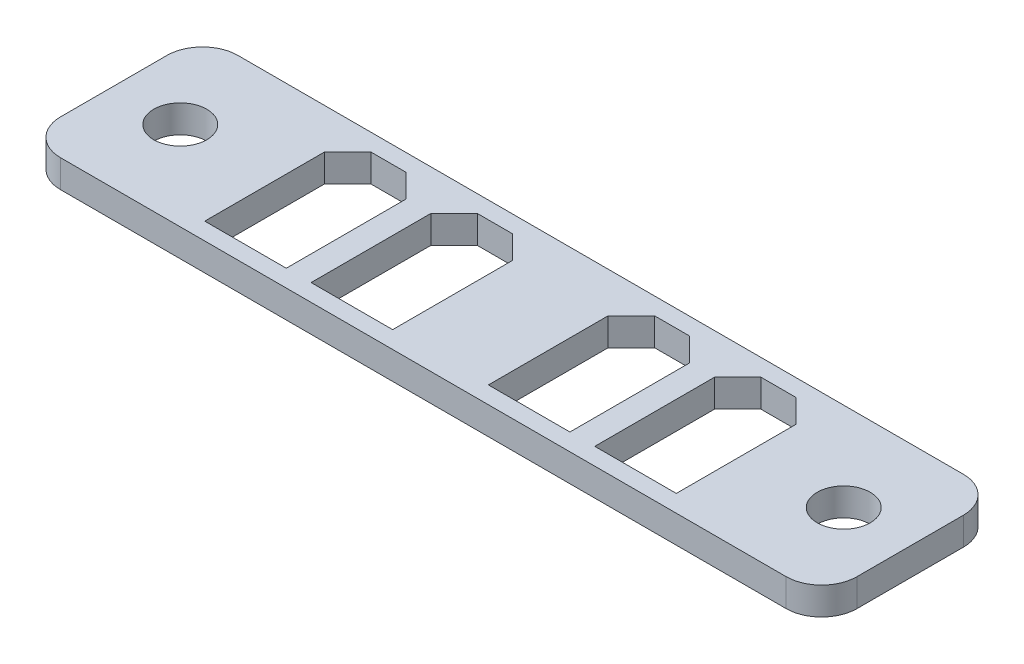
ISO-10303-21;
HEADER;
FILE_DESCRIPTION(('STEP AP214'),'2;1');
FILE_NAME('part.step','',(''),(''),'','','');
FILE_SCHEMA(('AUTOMOTIVE_DESIGN { 1 0 10303 214 1 1 1 1 }'));
ENDSEC;
DATA;
#1=APPLICATION_CONTEXT('core data for automotive mechanical design processes');
#2=APPLICATION_PROTOCOL_DEFINITION('international standard','automotive_design',2000,#1);
#3=PRODUCT_CONTEXT('',#1,'mechanical');
#4=PRODUCT('Part','Part','',(#3));
#5=PRODUCT_RELATED_PRODUCT_CATEGORY('part','',(#4));
#6=PRODUCT_DEFINITION_FORMATION('','',#4);
#7=PRODUCT_DEFINITION_CONTEXT('part definition',#1,'design');
#8=PRODUCT_DEFINITION('design','',#6,#7);
#9=PRODUCT_DEFINITION_SHAPE('','',#8);
#10=(LENGTH_UNIT() NAMED_UNIT(*) SI_UNIT(.MILLI.,.METRE.));
#11=(NAMED_UNIT(*) PLANE_ANGLE_UNIT() SI_UNIT($,.RADIAN.));
#12=(NAMED_UNIT(*) SI_UNIT($,.STERADIAN.) SOLID_ANGLE_UNIT());
#13=UNCERTAINTY_MEASURE_WITH_UNIT(LENGTH_MEASURE(1.E-05),#10,'distance_accuracy_value','');
#14=(GEOMETRIC_REPRESENTATION_CONTEXT(3) GLOBAL_UNCERTAINTY_ASSIGNED_CONTEXT((#13)) GLOBAL_UNIT_ASSIGNED_CONTEXT((#10,
#11,#12)) REPRESENTATION_CONTEXT('',''));
#15=CARTESIAN_POINT('',(0.,0.,0.));
#16=DIRECTION('',(0.,0.,1.));
#17=DIRECTION('',(1.,0.,0.));
#18=AXIS2_PLACEMENT_3D('',#15,#16,#17);
#19=CARTESIAN_POINT('',(0.,1.984375,0.));
#20=DIRECTION('',(0.,-1.,0.));
#21=DIRECTION('',(0.,0.,-1.));
#22=AXIS2_PLACEMENT_3D('',#19,#20,#21);
#23=PLANE('',#22);
#24=DIRECTION('',(-0.707199201768532,0.,-0.707014348523388));
#25=VECTOR('',#24,1.);
#26=CARTESIAN_POINT('',(15.8132827399145,1.984375,-11.47));
#27=LINE('',#26,#25);
#28=CARTESIAN_POINT('',(17.475,1.984375,-9.80871709253716));
#29=VERTEX_POINT('',#28);
#30=CARTESIAN_POINT('',(15.8132827399145,1.984375,-11.47));
#31=VERTEX_POINT('',#30);
#32=EDGE_CURVE('E276',#29,#31,#27,.T.);
#33=ORIENTED_EDGE('',*,*,#32,.F.);
#34=DIRECTION('',(0.,0.,-1.));
#35=VECTOR('',#34,1.);
#36=CARTESIAN_POINT('',(17.475,1.984375,-9.80871709253716));
#37=LINE('',#36,#35);
#38=CARTESIAN_POINT('',(17.475,1.984375,-1.23));
#39=VERTEX_POINT('',#38);
#40=EDGE_CURVE('E267',#39,#29,#37,.T.);
#41=ORIENTED_EDGE('',*,*,#40,.F.);
#42=DIRECTION('',(1.,0.,0.));
#43=VECTOR('',#42,1.);
#44=CARTESIAN_POINT('',(17.475,1.984375,-1.23));
#45=LINE('',#44,#43);
#46=CARTESIAN_POINT('',(11.635,1.984375,-1.23));
#47=VERTEX_POINT('',#46);
#48=EDGE_CURVE('E268',#47,#39,#45,.T.);
#49=ORIENTED_EDGE('',*,*,#48,.F.);
#50=DIRECTION('',(0.,0.,1.));
#51=VECTOR('',#50,1.);
#52=CARTESIAN_POINT('',(11.635,1.984375,-1.23));
#53=LINE('',#52,#51);
#54=CARTESIAN_POINT('',(11.635,1.984375,-9.80871709253716));
#55=VERTEX_POINT('',#54);
#56=EDGE_CURVE('E289',#55,#47,#53,.T.);
#57=ORIENTED_EDGE('',*,*,#56,.F.);
#58=DIRECTION('',(-0.707199201768532,0.,0.707014348523388));
#59=VECTOR('',#58,1.);
#60=CARTESIAN_POINT('',(11.635,1.984375,-9.80871709253716));
#61=LINE('',#60,#59);
#62=CARTESIAN_POINT('',(13.2967172600855,1.984375,-11.47));
#63=VERTEX_POINT('',#62);
#64=EDGE_CURVE('E286',#63,#55,#61,.T.);
#65=ORIENTED_EDGE('',*,*,#64,.F.);
#66=DIRECTION('',(-1.,0.,0.));
#67=VECTOR('',#66,1.);
#68=CARTESIAN_POINT('',(13.2967172600855,1.984375,-11.47));
#69=LINE('',#68,#67);
#70=EDGE_CURVE('E283',#31,#63,#69,.T.);
#71=ORIENTED_EDGE('',*,*,#70,.F.);
#72=EDGE_LOOP('',(#33,#41,#49,#57,#65,#71));
#73=FACE_BOUND('',#72,.T.);
#74=DIRECTION('',(-0.707199201768533,0.,-0.707014348523387));
#75=VECTOR('',#74,1.);
#76=CARTESIAN_POINT('',(36.1332827399145,1.984375,-11.47));
#77=LINE('',#76,#75);
#78=CARTESIAN_POINT('',(37.795,1.984375,-9.80871709253716));
#79=VERTEX_POINT('',#78);
#80=CARTESIAN_POINT('',(36.1332827399145,1.984375,-11.47));
#81=VERTEX_POINT('',#80);
#82=EDGE_CURVE('E319',#79,#81,#77,.T.);
#83=ORIENTED_EDGE('',*,*,#82,.F.);
#84=DIRECTION('',(0.,0.,-1.));
#85=VECTOR('',#84,1.);
#86=CARTESIAN_POINT('',(37.795,1.984375,-9.80871709253716));
#87=LINE('',#86,#85);
#88=CARTESIAN_POINT('',(37.795,1.984375,-1.23));
#89=VERTEX_POINT('',#88);
#90=EDGE_CURVE('E317',#89,#79,#87,.T.);
#91=ORIENTED_EDGE('',*,*,#90,.F.);
#92=DIRECTION('',(1.,0.,0.));
#93=VECTOR('',#92,1.);
#94=CARTESIAN_POINT('',(37.795,1.984375,-1.23));
#95=LINE('',#94,#93);
#96=CARTESIAN_POINT('',(31.955,1.984375,-1.23));
#97=VERTEX_POINT('',#96);
#98=EDGE_CURVE('E331',#97,#89,#95,.T.);
#99=ORIENTED_EDGE('',*,*,#98,.F.);
#100=DIRECTION('',(0.,0.,1.));
#101=VECTOR('',#100,1.);
#102=CARTESIAN_POINT('',(31.955,1.984375,-1.23));
#103=LINE('',#102,#101);
#104=CARTESIAN_POINT('',(31.955,1.984375,-9.80871709253716));
#105=VERTEX_POINT('',#104);
#106=EDGE_CURVE('E328',#105,#97,#103,.T.);
#107=ORIENTED_EDGE('',*,*,#106,.F.);
#108=DIRECTION('',(-0.707199201768532,0.,0.707014348523389));
#109=VECTOR('',#108,1.);
#110=CARTESIAN_POINT('',(31.955,1.984375,-9.80871709253716));
#111=LINE('',#110,#109);
#112=CARTESIAN_POINT('',(33.6167172600855,1.984375,-11.47));
#113=VERTEX_POINT('',#112);
#114=EDGE_CURVE('E325',#113,#105,#111,.T.);
#115=ORIENTED_EDGE('',*,*,#114,.F.);
#116=DIRECTION('',(-1.,0.,0.));
#117=VECTOR('',#116,1.);
#118=CARTESIAN_POINT('',(33.6167172600855,1.984375,-11.47));
#119=LINE('',#118,#117);
#120=EDGE_CURVE('E322',#81,#113,#119,.T.);
#121=ORIENTED_EDGE('',*,*,#120,.F.);
#122=EDGE_LOOP('',(#83,#91,#99,#107,#115,#121));
#123=FACE_BOUND('',#122,.T.);
#124=DIRECTION('',(-0.707199201768533,0.,-0.707014348523388));
#125=VECTOR('',#124,1.);
#126=CARTESIAN_POINT('',(23.4332827399145,1.984375,-11.47));
#127=LINE('',#126,#125);
#128=CARTESIAN_POINT('',(25.095,1.984375,-9.80871709253716));
#129=VERTEX_POINT('',#128);
#130=CARTESIAN_POINT('',(23.4332827399145,1.984375,-11.47));
#131=VERTEX_POINT('',#130);
#132=EDGE_CURVE('E417',#129,#131,#127,.T.);
#133=ORIENTED_EDGE('',*,*,#132,.F.);
#134=DIRECTION('',(0.,0.,-1.));
#135=VECTOR('',#134,1.);
#136=CARTESIAN_POINT('',(25.095,1.984375,-9.80871709253716));
#137=LINE('',#136,#135);
#138=CARTESIAN_POINT('',(25.095,1.984375,-1.23));
#139=VERTEX_POINT('',#138);
#140=EDGE_CURVE('E415',#139,#129,#137,.T.);
#141=ORIENTED_EDGE('',*,*,#140,.F.);
#142=DIRECTION('',(1.,0.,0.));
#143=VECTOR('',#142,1.);
#144=CARTESIAN_POINT('',(25.095,1.984375,-1.23));
#145=LINE('',#144,#143);
#146=CARTESIAN_POINT('',(19.255,1.984375,-1.23));
#147=VERTEX_POINT('',#146);
#148=EDGE_CURVE('E429',#147,#139,#145,.T.);
#149=ORIENTED_EDGE('',*,*,#148,.F.);
#150=DIRECTION('',(0.,0.,1.));
#151=VECTOR('',#150,1.);
#152=CARTESIAN_POINT('',(19.255,1.984375,-1.23));
#153=LINE('',#152,#151);
#154=CARTESIAN_POINT('',(19.255,1.984375,-9.80871709253716));
#155=VERTEX_POINT('',#154);
#156=EDGE_CURVE('E426',#155,#147,#153,.T.);
#157=ORIENTED_EDGE('',*,*,#156,.F.);
#158=DIRECTION('',(-0.707199201768533,0.,0.707014348523388));
#159=VECTOR('',#158,1.);
#160=CARTESIAN_POINT('',(19.255,1.984375,-9.80871709253716));
#161=LINE('',#160,#159);
#162=CARTESIAN_POINT('',(20.9167172600855,1.984375,-11.47));
#163=VERTEX_POINT('',#162);
#164=EDGE_CURVE('E423',#163,#155,#161,.T.);
#165=ORIENTED_EDGE('',*,*,#164,.F.);
#166=DIRECTION('',(-1.,0.,0.));
#167=VECTOR('',#166,1.);
#168=CARTESIAN_POINT('',(20.9167172600855,1.984375,-11.47));
#169=LINE('',#168,#167);
#170=EDGE_CURVE('E420',#131,#163,#169,.T.);
#171=ORIENTED_EDGE('',*,*,#170,.F.);
#172=EDGE_LOOP('',(#133,#141,#149,#157,#165,#171));
#173=FACE_BOUND('',#172,.T.);
#174=DIRECTION('',(-0.707199201768533,0.,-0.707014348523387));
#175=VECTOR('',#174,1.);
#176=CARTESIAN_POINT('',(43.7532827399145,1.984375,-11.47));
#177=LINE('',#176,#175);
#178=CARTESIAN_POINT('',(45.415,1.984375,-9.80871709253716));
#179=VERTEX_POINT('',#178);
#180=CARTESIAN_POINT('',(43.7532827399145,1.984375,-11.47));
#181=VERTEX_POINT('',#180);
#182=EDGE_CURVE('E369',#179,#181,#177,.T.);
#183=ORIENTED_EDGE('',*,*,#182,.F.);
#184=DIRECTION('',(0.,0.,-1.));
#185=VECTOR('',#184,1.);
#186=CARTESIAN_POINT('',(45.415,1.984375,-9.80871709253716));
#187=LINE('',#186,#185);
#188=CARTESIAN_POINT('',(45.415,1.984375,-1.23));
#189=VERTEX_POINT('',#188);
#190=EDGE_CURVE('E367',#189,#179,#187,.T.);
#191=ORIENTED_EDGE('',*,*,#190,.F.);
#192=DIRECTION('',(1.,0.,0.));
#193=VECTOR('',#192,1.);
#194=CARTESIAN_POINT('',(45.415,1.984375,-1.23));
#195=LINE('',#194,#193);
#196=CARTESIAN_POINT('',(39.575,1.984375,-1.23));
#197=VERTEX_POINT('',#196);
#198=EDGE_CURVE('E381',#197,#189,#195,.T.);
#199=ORIENTED_EDGE('',*,*,#198,.F.);
#200=DIRECTION('',(0.,0.,1.));
#201=VECTOR('',#200,1.);
#202=CARTESIAN_POINT('',(39.575,1.984375,-1.23));
#203=LINE('',#202,#201);
#204=CARTESIAN_POINT('',(39.575,1.984375,-9.80871709253716));
#205=VERTEX_POINT('',#204);
#206=EDGE_CURVE('E378',#205,#197,#203,.T.);
#207=ORIENTED_EDGE('',*,*,#206,.F.);
#208=DIRECTION('',(-0.707199201768532,0.,0.707014348523389));
#209=VECTOR('',#208,1.);
#210=CARTESIAN_POINT('',(39.575,1.984375,-9.80871709253716));
#211=LINE('',#210,#209);
#212=CARTESIAN_POINT('',(41.2367172600855,1.984375,-11.47));
#213=VERTEX_POINT('',#212);
#214=EDGE_CURVE('E375',#213,#205,#211,.T.);
#215=ORIENTED_EDGE('',*,*,#214,.F.);
#216=DIRECTION('',(-1.,0.,0.));
#217=VECTOR('',#216,1.);
#218=CARTESIAN_POINT('',(41.2367172600855,1.984375,-11.47));
#219=LINE('',#218,#217);
#220=EDGE_CURVE('E372',#181,#213,#219,.T.);
#221=ORIENTED_EDGE('',*,*,#220,.F.);
#222=EDGE_LOOP('',(#183,#191,#199,#207,#215,#221));
#223=FACE_BOUND('',#222,.T.);
#224=DIRECTION('',(0.,0.,1.));
#225=VECTOR('',#224,1.);
#226=CARTESIAN_POINT('',(0.,1.984375,0.));
#227=LINE('',#226,#225);
#228=CARTESIAN_POINT('',(0.,1.984375,-10.16));
#229=VERTEX_POINT('',#228);
#230=CARTESIAN_POINT('',(0.,1.984375,-2.54));
#231=VERTEX_POINT('',#230);
#232=EDGE_CURVE('E459',#229,#231,#227,.T.);
#233=ORIENTED_EDGE('',*,*,#232,.T.);
#234=CARTESIAN_POINT('',(2.54,1.984375,-2.54));
#235=DIRECTION('',(0.,-1.,0.));
#236=DIRECTION('',(0.,0.,-1.));
#237=AXIS2_PLACEMENT_3D('',#234,#235,#236);
#238=CIRCLE('',#237,2.54);
#239=CARTESIAN_POINT('',(2.54,1.984375,0.));
#240=VERTEX_POINT('',#239);
#241=EDGE_CURVE('E502',#231,#240,#238,.F.);
#242=ORIENTED_EDGE('',*,*,#241,.T.);
#243=DIRECTION('',(1.,0.,0.));
#244=VECTOR('',#243,1.);
#245=CARTESIAN_POINT('',(0.,1.984375,0.));
#246=LINE('',#245,#244);
#247=CARTESIAN_POINT('',(54.51,1.984375,0.));
#248=VERTEX_POINT('',#247);
#249=EDGE_CURVE('E462',#240,#248,#246,.T.);
#250=ORIENTED_EDGE('',*,*,#249,.T.);
#251=CARTESIAN_POINT('',(54.51,1.984375,-2.54));
#252=DIRECTION('',(0.,-1.,0.));
#253=DIRECTION('',(0.,0.,-1.));
#254=AXIS2_PLACEMENT_3D('',#251,#252,#253);
#255=CIRCLE('',#254,2.54);
#256=CARTESIAN_POINT('',(57.05,1.984375,-2.54));
#257=VERTEX_POINT('',#256);
#258=EDGE_CURVE('E498',#248,#257,#255,.F.);
#259=ORIENTED_EDGE('',*,*,#258,.T.);
#260=DIRECTION('',(0.,0.,-1.));
#261=VECTOR('',#260,1.);
#262=CARTESIAN_POINT('',(57.05,1.984375,0.));
#263=LINE('',#262,#261);
#264=CARTESIAN_POINT('',(57.05,1.984375,-10.16));
#265=VERTEX_POINT('',#264);
#266=EDGE_CURVE('E466',#257,#265,#263,.T.);
#267=ORIENTED_EDGE('',*,*,#266,.T.);
#268=CARTESIAN_POINT('',(54.51,1.984375,-10.16));
#269=DIRECTION('',(0.,-1.,0.));
#270=DIRECTION('',(0.,0.,-1.));
#271=AXIS2_PLACEMENT_3D('',#268,#269,#270);
#272=CIRCLE('',#271,2.54);
#273=CARTESIAN_POINT('',(54.51,1.984375,-12.7));
#274=VERTEX_POINT('',#273);
#275=EDGE_CURVE('E59',#265,#274,#272,.F.);
#276=ORIENTED_EDGE('',*,*,#275,.T.);
#277=DIRECTION('',(-1.,0.,0.));
#278=VECTOR('',#277,1.);
#279=CARTESIAN_POINT('',(0.,1.984375,-12.7));
#280=LINE('',#279,#278);
#281=CARTESIAN_POINT('',(2.54,1.984375,-12.7));
#282=VERTEX_POINT('',#281);
#283=EDGE_CURVE('E468',#274,#282,#280,.T.);
#284=ORIENTED_EDGE('',*,*,#283,.T.);
#285=CARTESIAN_POINT('',(2.54,1.984375,-10.16));
#286=DIRECTION('',(0.,-1.,0.));
#287=DIRECTION('',(0.,0.,-1.));
#288=AXIS2_PLACEMENT_3D('',#285,#286,#287);
#289=CIRCLE('',#288,2.54);
#290=EDGE_CURVE('E500',#282,#229,#289,.F.);
#291=ORIENTED_EDGE('',*,*,#290,.T.);
#292=EDGE_LOOP('',(#233,#242,#250,#259,#267,#276,#284,#291));
#293=FACE_BOUND('',#292,.T.);
#294=CARTESIAN_POINT('',(52.2875,1.984375,-6.35));
#295=DIRECTION('',(0.,1.,0.));
#296=DIRECTION('',(0.,0.,1.));
#297=AXIS2_PLACEMENT_3D('',#294,#295,#296);
#298=CIRCLE('',#297,1.89865);
#299=CARTESIAN_POINT('',(52.2875,1.984375,-4.45135));
#300=VERTEX_POINT('',#299);
#301=EDGE_CURVE('E453',#300,#300,#298,.T.);
#302=ORIENTED_EDGE('',*,*,#301,.F.);
#303=EDGE_LOOP('',(#302));
#304=FACE_BOUND('',#303,.T.);
#305=CARTESIAN_POINT('',(4.7625,1.984375,-6.35));
#306=DIRECTION('',(0.,1.,0.));
#307=DIRECTION('',(0.,0.,1.));
#308=AXIS2_PLACEMENT_3D('',#305,#306,#307);
#309=CIRCLE('',#308,1.89865);
#310=CARTESIAN_POINT('',(4.7625,1.984375,-4.45135));
#311=VERTEX_POINT('',#310);
#312=EDGE_CURVE('E447',#311,#311,#309,.T.);
#313=ORIENTED_EDGE('',*,*,#312,.F.);
#314=EDGE_LOOP('',(#313));
#315=FACE_BOUND('',#314,.T.);
#316=ADVANCED_FACE('F37',(#73,#123,#173,#223,#293,#304,#315),#23,.F.);
#317=CARTESIAN_POINT('',(0.,0.,0.));
#318=DIRECTION('',(0.,-1.,0.));
#319=DIRECTION('',(0.,0.,-1.));
#320=AXIS2_PLACEMENT_3D('',#317,#318,#319);
#321=PLANE('',#320);
#322=DIRECTION('',(0.,0.,-1.));
#323=VECTOR('',#322,1.);
#324=CARTESIAN_POINT('',(17.475,0.,-9.80871709253716));
#325=LINE('',#324,#323);
#326=CARTESIAN_POINT('',(17.475,0.,-1.23));
#327=VERTEX_POINT('',#326);
#328=CARTESIAN_POINT('',(17.475,0.,-9.80871709253716));
#329=VERTEX_POINT('',#328);
#330=EDGE_CURVE('E264',#327,#329,#325,.T.);
#331=ORIENTED_EDGE('',*,*,#330,.T.);
#332=DIRECTION('',(-0.707199201768532,0.,-0.707014348523388));
#333=VECTOR('',#332,1.);
#334=CARTESIAN_POINT('',(15.8132827399145,0.,-11.47));
#335=LINE('',#334,#333);
#336=CARTESIAN_POINT('',(15.8132827399145,0.,-11.47));
#337=VERTEX_POINT('',#336);
#338=EDGE_CURVE('E248',#329,#337,#335,.T.);
#339=ORIENTED_EDGE('',*,*,#338,.T.);
#340=DIRECTION('',(-1.,0.,0.));
#341=VECTOR('',#340,1.);
#342=CARTESIAN_POINT('',(13.2967172600855,0.,-11.47));
#343=LINE('',#342,#341);
#344=CARTESIAN_POINT('',(13.2967172600855,0.,-11.47));
#345=VERTEX_POINT('',#344);
#346=EDGE_CURVE('E400',#337,#345,#343,.T.);
#347=ORIENTED_EDGE('',*,*,#346,.T.);
#348=DIRECTION('',(-0.707199201768532,0.,0.707014348523388));
#349=VECTOR('',#348,1.);
#350=CARTESIAN_POINT('',(11.635,0.,-9.80871709253716));
#351=LINE('',#350,#349);
#352=CARTESIAN_POINT('',(11.635,0.,-9.80871709253716));
#353=VERTEX_POINT('',#352);
#354=EDGE_CURVE('E874',#345,#353,#351,.T.);
#355=ORIENTED_EDGE('',*,*,#354,.T.);
#356=DIRECTION('',(0.,0.,1.));
#357=VECTOR('',#356,1.);
#358=CARTESIAN_POINT('',(11.635,0.,-1.23));
#359=LINE('',#358,#357);
#360=CARTESIAN_POINT('',(11.635,0.,-1.23));
#361=VERTEX_POINT('',#360);
#362=EDGE_CURVE('E278',#353,#361,#359,.T.);
#363=ORIENTED_EDGE('',*,*,#362,.T.);
#364=DIRECTION('',(1.,0.,0.));
#365=VECTOR('',#364,1.);
#366=CARTESIAN_POINT('',(17.475,0.,-1.23));
#367=LINE('',#366,#365);
#368=EDGE_CURVE('E274',#361,#327,#367,.T.);
#369=ORIENTED_EDGE('',*,*,#368,.T.);
#370=EDGE_LOOP('',(#331,#339,#347,#355,#363,#369));
#371=FACE_BOUND('',#370,.T.);
#372=DIRECTION('',(0.,0.,-1.));
#373=VECTOR('',#372,1.);
#374=CARTESIAN_POINT('',(37.795,0.,-9.80871709253716));
#375=LINE('',#374,#373);
#376=CARTESIAN_POINT('',(37.795,0.,-1.23));
#377=VERTEX_POINT('',#376);
#378=CARTESIAN_POINT('',(37.795,0.,-9.80871709253716));
#379=VERTEX_POINT('',#378);
#380=EDGE_CURVE('E314',#377,#379,#375,.T.);
#381=ORIENTED_EDGE('',*,*,#380,.T.);
#382=DIRECTION('',(-0.707199201768533,0.,-0.707014348523387));
#383=VECTOR('',#382,1.);
#384=CARTESIAN_POINT('',(36.1332827399145,0.,-11.47));
#385=LINE('',#384,#383);
#386=CARTESIAN_POINT('',(36.1332827399145,0.,-11.47));
#387=VERTEX_POINT('',#386);
#388=EDGE_CURVE('E337',#379,#387,#385,.T.);
#389=ORIENTED_EDGE('',*,*,#388,.T.);
#390=DIRECTION('',(-1.,0.,0.));
#391=VECTOR('',#390,1.);
#392=CARTESIAN_POINT('',(33.6167172600855,0.,-11.47));
#393=LINE('',#392,#391);
#394=CARTESIAN_POINT('',(33.6167172600855,0.,-11.47));
#395=VERTEX_POINT('',#394);
#396=EDGE_CURVE('E302',#387,#395,#393,.T.);
#397=ORIENTED_EDGE('',*,*,#396,.T.);
#398=DIRECTION('',(-0.707199201768532,0.,0.707014348523389));
#399=VECTOR('',#398,1.);
#400=CARTESIAN_POINT('',(31.955,0.,-9.80871709253716));
#401=LINE('',#400,#399);
#402=CARTESIAN_POINT('',(31.955,0.,-9.80871709253716));
#403=VERTEX_POINT('',#402);
#404=EDGE_CURVE('E305',#395,#403,#401,.T.);
#405=ORIENTED_EDGE('',*,*,#404,.T.);
#406=DIRECTION('',(0.,0.,1.));
#407=VECTOR('',#406,1.);
#408=CARTESIAN_POINT('',(31.955,0.,-1.23));
#409=LINE('',#408,#407);
#410=CARTESIAN_POINT('',(31.955,0.,-1.23));
#411=VERTEX_POINT('',#410);
#412=EDGE_CURVE('E308',#403,#411,#409,.T.);
#413=ORIENTED_EDGE('',*,*,#412,.T.);
#414=DIRECTION('',(1.,0.,0.));
#415=VECTOR('',#414,1.);
#416=CARTESIAN_POINT('',(37.795,0.,-1.23));
#417=LINE('',#416,#415);
#418=EDGE_CURVE('E311',#411,#377,#417,.T.);
#419=ORIENTED_EDGE('',*,*,#418,.T.);
#420=EDGE_LOOP('',(#381,#389,#397,#405,#413,#419));
#421=FACE_BOUND('',#420,.T.);
#422=DIRECTION('',(0.,0.,-1.));
#423=VECTOR('',#422,1.);
#424=CARTESIAN_POINT('',(25.095,0.,-9.80871709253716));
#425=LINE('',#424,#423);
#426=CARTESIAN_POINT('',(25.095,0.,-1.23));
#427=VERTEX_POINT('',#426);
#428=CARTESIAN_POINT('',(25.095,0.,-9.80871709253716));
#429=VERTEX_POINT('',#428);
#430=EDGE_CURVE('E412',#427,#429,#425,.T.);
#431=ORIENTED_EDGE('',*,*,#430,.T.);
#432=DIRECTION('',(-0.707199201768533,0.,-0.707014348523388));
#433=VECTOR('',#432,1.);
#434=CARTESIAN_POINT('',(23.4332827399145,0.,-11.47));
#435=LINE('',#434,#433);
#436=CARTESIAN_POINT('',(23.4332827399145,0.,-11.47));
#437=VERTEX_POINT('',#436);
#438=EDGE_CURVE('E355',#429,#437,#435,.T.);
#439=ORIENTED_EDGE('',*,*,#438,.T.);
#440=DIRECTION('',(-1.,0.,0.));
#441=VECTOR('',#440,1.);
#442=CARTESIAN_POINT('',(20.9167172600855,0.,-11.47));
#443=LINE('',#442,#441);
#444=CARTESIAN_POINT('',(20.9167172600855,0.,-11.47));
#445=VERTEX_POINT('',#444);
#446=EDGE_CURVE('E350',#437,#445,#443,.T.);
#447=ORIENTED_EDGE('',*,*,#446,.T.);
#448=DIRECTION('',(-0.707199201768533,0.,0.707014348523388));
#449=VECTOR('',#448,1.);
#450=CARTESIAN_POINT('',(19.255,0.,-9.80871709253716));
#451=LINE('',#450,#449);
#452=CARTESIAN_POINT('',(19.255,0.,-9.80871709253716));
#453=VERTEX_POINT('',#452);
#454=EDGE_CURVE('E403',#445,#453,#451,.T.);
#455=ORIENTED_EDGE('',*,*,#454,.T.);
#456=DIRECTION('',(0.,0.,1.));
#457=VECTOR('',#456,1.);
#458=CARTESIAN_POINT('',(19.255,0.,-1.23));
#459=LINE('',#458,#457);
#460=CARTESIAN_POINT('',(19.255,0.,-1.23));
#461=VERTEX_POINT('',#460);
#462=EDGE_CURVE('E406',#453,#461,#459,.T.);
#463=ORIENTED_EDGE('',*,*,#462,.T.);
#464=DIRECTION('',(1.,0.,0.));
#465=VECTOR('',#464,1.);
#466=CARTESIAN_POINT('',(25.095,0.,-1.23));
#467=LINE('',#466,#465);
#468=EDGE_CURVE('E409',#461,#427,#467,.T.);
#469=ORIENTED_EDGE('',*,*,#468,.T.);
#470=EDGE_LOOP('',(#431,#439,#447,#455,#463,#469));
#471=FACE_BOUND('',#470,.T.);
#472=DIRECTION('',(0.,0.,-1.));
#473=VECTOR('',#472,1.);
#474=CARTESIAN_POINT('',(45.415,0.,-9.80871709253716));
#475=LINE('',#474,#473);
#476=CARTESIAN_POINT('',(45.415,0.,-1.23));
#477=VERTEX_POINT('',#476);
#478=CARTESIAN_POINT('',(45.415,0.,-9.80871709253715));
#479=VERTEX_POINT('',#478);
#480=EDGE_CURVE('E364',#477,#479,#475,.T.);
#481=ORIENTED_EDGE('',*,*,#480,.T.);
#482=DIRECTION('',(-0.707199201768533,0.,-0.707014348523387));
#483=VECTOR('',#482,1.);
#484=CARTESIAN_POINT('',(43.7532827399145,0.,-11.47));
#485=LINE('',#484,#483);
#486=CARTESIAN_POINT('',(43.7532827399145,0.,-11.47));
#487=VERTEX_POINT('',#486);
#488=EDGE_CURVE('E387',#479,#487,#485,.T.);
#489=ORIENTED_EDGE('',*,*,#488,.T.);
#490=DIRECTION('',(-1.,0.,0.));
#491=VECTOR('',#490,1.);
#492=CARTESIAN_POINT('',(41.2367172600855,0.,-11.47));
#493=LINE('',#492,#491);
#494=CARTESIAN_POINT('',(41.2367172600855,0.,-11.47));
#495=VERTEX_POINT('',#494);
#496=EDGE_CURVE('E351',#487,#495,#493,.T.);
#497=ORIENTED_EDGE('',*,*,#496,.T.);
#498=DIRECTION('',(-0.707199201768532,0.,0.707014348523389));
#499=VECTOR('',#498,1.);
#500=CARTESIAN_POINT('',(39.575,0.,-9.80871709253716));
#501=LINE('',#500,#499);
#502=CARTESIAN_POINT('',(39.575,0.,-9.80871709253715));
#503=VERTEX_POINT('',#502);
#504=EDGE_CURVE('E354',#495,#503,#501,.T.);
#505=ORIENTED_EDGE('',*,*,#504,.T.);
#506=DIRECTION('',(0.,0.,1.));
#507=VECTOR('',#506,1.);
#508=CARTESIAN_POINT('',(39.575,0.,-1.23));
#509=LINE('',#508,#507);
#510=CARTESIAN_POINT('',(39.575,0.,-1.23));
#511=VERTEX_POINT('',#510);
#512=EDGE_CURVE('E358',#503,#511,#509,.T.);
#513=ORIENTED_EDGE('',*,*,#512,.T.);
#514=DIRECTION('',(1.,0.,0.));
#515=VECTOR('',#514,1.);
#516=CARTESIAN_POINT('',(45.415,0.,-1.23));
#517=LINE('',#516,#515);
#518=EDGE_CURVE('E361',#511,#477,#517,.T.);
#519=ORIENTED_EDGE('',*,*,#518,.T.);
#520=EDGE_LOOP('',(#481,#489,#497,#505,#513,#519));
#521=FACE_BOUND('',#520,.T.);
#522=CARTESIAN_POINT('',(52.2875,0.,-6.35));
#523=DIRECTION('',(0.,1.,0.));
#524=DIRECTION('',(0.,0.,1.));
#525=AXIS2_PLACEMENT_3D('',#522,#523,#524);
#526=CIRCLE('',#525,1.89865);
#527=CARTESIAN_POINT('',(52.2875,0.,-4.45135));
#528=VERTEX_POINT('',#527);
#529=EDGE_CURVE('E450',#528,#528,#526,.T.);
#530=ORIENTED_EDGE('',*,*,#529,.T.);
#531=EDGE_LOOP('',(#530));
#532=FACE_BOUND('',#531,.T.);
#533=DIRECTION('',(1.,0.,0.));
#534=VECTOR('',#533,1.);
#535=CARTESIAN_POINT('',(0.,0.,0.));
#536=LINE('',#535,#534);
#537=CARTESIAN_POINT('',(2.54,0.,0.));
#538=VERTEX_POINT('',#537);
#539=CARTESIAN_POINT('',(54.51,0.,0.));
#540=VERTEX_POINT('',#539);
#541=EDGE_CURVE('E473',#538,#540,#536,.T.);
#542=ORIENTED_EDGE('',*,*,#541,.F.);
#543=CARTESIAN_POINT('',(2.54,0.,-2.54));
#544=DIRECTION('',(0.,-1.,0.));
#545=DIRECTION('',(0.,0.,-1.));
#546=AXIS2_PLACEMENT_3D('',#543,#544,#545);
#547=CIRCLE('',#546,2.54);
#548=CARTESIAN_POINT('',(0.,0.,-2.54));
#549=VERTEX_POINT('',#548);
#550=EDGE_CURVE('E490',#538,#549,#547,.T.);
#551=ORIENTED_EDGE('',*,*,#550,.T.);
#552=DIRECTION('',(0.,0.,1.));
#553=VECTOR('',#552,1.);
#554=CARTESIAN_POINT('',(0.,0.,0.));
#555=LINE('',#554,#553);
#556=CARTESIAN_POINT('',(0.,0.,-10.16));
#557=VERTEX_POINT('',#556);
#558=EDGE_CURVE('E456',#557,#549,#555,.T.);
#559=ORIENTED_EDGE('',*,*,#558,.F.);
#560=CARTESIAN_POINT('',(2.54,0.,-10.16));
#561=DIRECTION('',(0.,-1.,0.));
#562=DIRECTION('',(0.,0.,-1.));
#563=AXIS2_PLACEMENT_3D('',#560,#561,#562);
#564=CIRCLE('',#563,2.54);
#565=CARTESIAN_POINT('',(2.54,0.,-12.7));
#566=VERTEX_POINT('',#565);
#567=EDGE_CURVE('E488',#557,#566,#564,.T.);
#568=ORIENTED_EDGE('',*,*,#567,.T.);
#569=DIRECTION('',(-1.,0.,0.));
#570=VECTOR('',#569,1.);
#571=CARTESIAN_POINT('',(0.,0.,-12.7));
#572=LINE('',#571,#570);
#573=CARTESIAN_POINT('',(54.51,0.,-12.7));
#574=VERTEX_POINT('',#573);
#575=EDGE_CURVE('E463',#574,#566,#572,.T.);
#576=ORIENTED_EDGE('',*,*,#575,.F.);
#577=CARTESIAN_POINT('',(54.51,0.,-10.16));
#578=DIRECTION('',(0.,-1.,0.));
#579=DIRECTION('',(0.,0.,-1.));
#580=AXIS2_PLACEMENT_3D('',#577,#578,#579);
#581=CIRCLE('',#580,2.54);
#582=CARTESIAN_POINT('',(57.05,0.,-10.16));
#583=VERTEX_POINT('',#582);
#584=EDGE_CURVE('E484',#574,#583,#581,.T.);
#585=ORIENTED_EDGE('',*,*,#584,.T.);
#586=DIRECTION('',(0.,0.,-1.));
#587=VECTOR('',#586,1.);
#588=CARTESIAN_POINT('',(57.05,0.,0.));
#589=LINE('',#588,#587);
#590=CARTESIAN_POINT('',(57.05,0.,-2.54));
#591=VERTEX_POINT('',#590);
#592=EDGE_CURVE('E476',#591,#583,#589,.T.);
#593=ORIENTED_EDGE('',*,*,#592,.F.);
#594=CARTESIAN_POINT('',(54.51,0.,-2.54));
#595=DIRECTION('',(0.,-1.,0.));
#596=DIRECTION('',(0.,0.,-1.));
#597=AXIS2_PLACEMENT_3D('',#594,#595,#596);
#598=CIRCLE('',#597,2.54);
#599=EDGE_CURVE('E486',#591,#540,#598,.T.);
#600=ORIENTED_EDGE('',*,*,#599,.T.);
#601=EDGE_LOOP('',(#542,#551,#559,#568,#576,#585,#593,#600));
#602=FACE_BOUND('',#601,.T.);
#603=CARTESIAN_POINT('',(4.7625,0.,-6.35));
#604=DIRECTION('',(0.,1.,0.));
#605=DIRECTION('',(0.,0.,1.));
#606=AXIS2_PLACEMENT_3D('',#603,#604,#605);
#607=CIRCLE('',#606,1.89865);
#608=CARTESIAN_POINT('',(4.7625,0.,-4.45135));
#609=VERTEX_POINT('',#608);
#610=EDGE_CURVE('E259',#609,#609,#607,.T.);
#611=ORIENTED_EDGE('',*,*,#610,.T.);
#612=EDGE_LOOP('',(#611));
#613=FACE_BOUND('',#612,.T.);
#614=ADVANCED_FACE('F271',(#371,#421,#471,#521,#532,#602,#613),#321,.T.);
#615=CARTESIAN_POINT('',(0.,1.984375,0.));
#616=DIRECTION('',(1.,0.,0.));
#617=DIRECTION('',(0.,0.,-1.));
#618=AXIS2_PLACEMENT_3D('',#615,#616,#617);
#619=PLANE('',#618);
#620=ORIENTED_EDGE('',*,*,#558,.T.);
#621=DIRECTION('',(0.,-1.,0.));
#622=VECTOR('',#621,1.);
#623=CARTESIAN_POINT('',(0.,1.984375,-2.54));
#624=LINE('',#623,#622);
#625=EDGE_CURVE('E495',#549,#231,#624,.F.);
#626=ORIENTED_EDGE('',*,*,#625,.T.);
#627=ORIENTED_EDGE('',*,*,#232,.F.);
#628=DIRECTION('',(0.,-1.,0.));
#629=VECTOR('',#628,1.);
#630=CARTESIAN_POINT('',(0.,1.984375,-10.16));
#631=LINE('',#630,#629);
#632=EDGE_CURVE('E492',#229,#557,#631,.T.);
#633=ORIENTED_EDGE('',*,*,#632,.T.);
#634=EDGE_LOOP('',(#620,#626,#627,#633));
#635=FACE_BOUND('',#634,.T.);
#636=ADVANCED_FACE('F529',(#635),#619,.F.);
#637=CARTESIAN_POINT('',(0.,1.984375,0.));
#638=DIRECTION('',(0.,0.,-1.));
#639=DIRECTION('',(-1.,0.,0.));
#640=AXIS2_PLACEMENT_3D('',#637,#638,#639);
#641=PLANE('',#640);
#642=ORIENTED_EDGE('',*,*,#249,.F.);
#643=DIRECTION('',(0.,-1.,0.));
#644=VECTOR('',#643,1.);
#645=CARTESIAN_POINT('',(2.54,1.984375,0.));
#646=LINE('',#645,#644);
#647=EDGE_CURVE('E481',#240,#538,#646,.T.);
#648=ORIENTED_EDGE('',*,*,#647,.T.);
#649=ORIENTED_EDGE('',*,*,#541,.T.);
#650=DIRECTION('',(0.,-1.,0.));
#651=VECTOR('',#650,1.);
#652=CARTESIAN_POINT('',(54.51,1.984375,0.));
#653=LINE('',#652,#651);
#654=EDGE_CURVE('E470',#540,#248,#653,.F.);
#655=ORIENTED_EDGE('',*,*,#654,.T.);
#656=EDGE_LOOP('',(#642,#648,#649,#655));
#657=FACE_BOUND('',#656,.T.);
#658=ADVANCED_FACE('F537',(#657),#641,.F.);
#659=CARTESIAN_POINT('',(57.05,1.984375,0.));
#660=DIRECTION('',(-1.,0.,0.));
#661=DIRECTION('',(0.,0.,1.));
#662=AXIS2_PLACEMENT_3D('',#659,#660,#661);
#663=PLANE('',#662);
#664=ORIENTED_EDGE('',*,*,#266,.F.);
#665=DIRECTION('',(0.,-1.,0.));
#666=VECTOR('',#665,1.);
#667=CARTESIAN_POINT('',(57.05,1.984375,-2.54));
#668=LINE('',#667,#666);
#669=EDGE_CURVE('E11',#257,#591,#668,.T.);
#670=ORIENTED_EDGE('',*,*,#669,.T.);
#671=ORIENTED_EDGE('',*,*,#592,.T.);
#672=DIRECTION('',(0.,-1.,0.));
#673=VECTOR('',#672,1.);
#674=CARTESIAN_POINT('',(57.05,1.984375,-10.16));
#675=LINE('',#674,#673);
#676=EDGE_CURVE('E45',#583,#265,#675,.F.);
#677=ORIENTED_EDGE('',*,*,#676,.T.);
#678=EDGE_LOOP('',(#664,#670,#671,#677));
#679=FACE_BOUND('',#678,.T.);
#680=ADVANCED_FACE('F510',(#679),#663,.F.);
#681=CARTESIAN_POINT('',(0.,1.984375,-12.7));
#682=DIRECTION('',(0.,0.,1.));
#683=DIRECTION('',(1.,0.,0.));
#684=AXIS2_PLACEMENT_3D('',#681,#682,#683);
#685=PLANE('',#684);
#686=ORIENTED_EDGE('',*,*,#575,.T.);
#687=DIRECTION('',(0.,-1.,0.));
#688=VECTOR('',#687,1.);
#689=CARTESIAN_POINT('',(2.54,1.984375,-12.7));
#690=LINE('',#689,#688);
#691=EDGE_CURVE('E52',#566,#282,#690,.F.);
#692=ORIENTED_EDGE('',*,*,#691,.T.);
#693=ORIENTED_EDGE('',*,*,#283,.F.);
#694=DIRECTION('',(0.,-1.,0.));
#695=VECTOR('',#694,1.);
#696=CARTESIAN_POINT('',(54.51,1.984375,-12.7));
#697=LINE('',#696,#695);
#698=EDGE_CURVE('E504',#274,#574,#697,.T.);
#699=ORIENTED_EDGE('',*,*,#698,.T.);
#700=EDGE_LOOP('',(#686,#692,#693,#699));
#701=FACE_BOUND('',#700,.T.);
#702=ADVANCED_FACE('F518',(#701),#685,.F.);
#703=CARTESIAN_POINT('',(52.2875,1.984375,-6.35));
#704=DIRECTION('',(0.,-1.,0.));
#705=DIRECTION('',(0.,0.,-1.));
#706=AXIS2_PLACEMENT_3D('',#703,#704,#705);
#707=CYLINDRICAL_SURFACE('',#706,1.89865);
#708=ORIENTED_EDGE('',*,*,#301,.T.);
#709=EDGE_LOOP('',(#708));
#710=FACE_BOUND('',#709,.T.);
#711=ORIENTED_EDGE('',*,*,#529,.F.);
#712=EDGE_LOOP('',(#711));
#713=FACE_BOUND('',#712,.T.);
#714=ADVANCED_FACE('F556',(#710,#713),#707,.F.);
#715=CARTESIAN_POINT('',(4.7625,1.984375,-6.35));
#716=DIRECTION('',(0.,-1.,0.));
#717=DIRECTION('',(0.,0.,-1.));
#718=AXIS2_PLACEMENT_3D('',#715,#716,#717);
#719=CYLINDRICAL_SURFACE('',#718,1.89865);
#720=ORIENTED_EDGE('',*,*,#312,.T.);
#721=EDGE_LOOP('',(#720));
#722=FACE_BOUND('',#721,.T.);
#723=ORIENTED_EDGE('',*,*,#610,.F.);
#724=EDGE_LOOP('',(#723));
#725=FACE_BOUND('',#724,.T.);
#726=ADVANCED_FACE('F633',(#722,#725),#719,.F.);
#727=CARTESIAN_POINT('',(45.415,-0.00100000000000013,-9.80871709253716));
#728=DIRECTION('',(1.,0.,0.));
#729=DIRECTION('',(0.,0.,-1.));
#730=AXIS2_PLACEMENT_3D('',#727,#728,#729);
#731=PLANE('',#730);
#732=DIRECTION('',(0.,1.,0.));
#733=VECTOR('',#732,1.);
#734=CARTESIAN_POINT('',(45.415,-0.00100000000000013,-1.23));
#735=LINE('',#734,#733);
#736=EDGE_CURVE('E385',#477,#189,#735,.T.);
#737=ORIENTED_EDGE('',*,*,#736,.T.);
#738=ORIENTED_EDGE('',*,*,#190,.T.);
#739=DIRECTION('',(0.,1.,0.));
#740=VECTOR('',#739,1.);
#741=CARTESIAN_POINT('',(45.415,-0.00100000000000013,-9.80871709253716));
#742=LINE('',#741,#740);
#743=EDGE_CURVE('E384',#479,#179,#742,.T.);
#744=ORIENTED_EDGE('',*,*,#743,.F.);
#745=ORIENTED_EDGE('',*,*,#480,.F.);
#746=EDGE_LOOP('',(#737,#738,#744,#745));
#747=FACE_BOUND('',#746,.T.);
#748=ADVANCED_FACE('F613',(#747),#731,.F.);
#749=CARTESIAN_POINT('',(45.415,-0.00100000000000013,-1.23));
#750=DIRECTION('',(0.,0.,1.));
#751=DIRECTION('',(1.,0.,0.));
#752=AXIS2_PLACEMENT_3D('',#749,#750,#751);
#753=PLANE('',#752);
#754=DIRECTION('',(0.,1.,0.));
#755=VECTOR('',#754,1.);
#756=CARTESIAN_POINT('',(39.575,-0.00100000000000013,-1.23));
#757=LINE('',#756,#755);
#758=EDGE_CURVE('E388',#511,#197,#757,.T.);
#759=ORIENTED_EDGE('',*,*,#758,.T.);
#760=ORIENTED_EDGE('',*,*,#198,.T.);
#761=ORIENTED_EDGE('',*,*,#736,.F.);
#762=ORIENTED_EDGE('',*,*,#518,.F.);
#763=EDGE_LOOP('',(#759,#760,#761,#762));
#764=FACE_BOUND('',#763,.T.);
#765=ADVANCED_FACE('F609',(#764),#753,.F.);
#766=CARTESIAN_POINT('',(39.575,-0.00100000000000013,-1.23));
#767=DIRECTION('',(-1.,0.,0.));
#768=DIRECTION('',(0.,0.,1.));
#769=AXIS2_PLACEMENT_3D('',#766,#767,#768);
#770=PLANE('',#769);
#771=DIRECTION('',(0.,1.,0.));
#772=VECTOR('',#771,1.);
#773=CARTESIAN_POINT('',(39.575,-0.00100000000000013,-9.80871709253716));
#774=LINE('',#773,#772);
#775=EDGE_CURVE('E390',#503,#205,#774,.T.);
#776=ORIENTED_EDGE('',*,*,#775,.T.);
#777=ORIENTED_EDGE('',*,*,#206,.T.);
#778=ORIENTED_EDGE('',*,*,#758,.F.);
#779=ORIENTED_EDGE('',*,*,#512,.F.);
#780=EDGE_LOOP('',(#776,#777,#778,#779));
#781=FACE_BOUND('',#780,.T.);
#782=ADVANCED_FACE('F612',(#781),#770,.F.);
#783=CARTESIAN_POINT('',(39.575,-0.00100000000000013,-9.80871709253716));
#784=DIRECTION('',(-0.707014348523389,0.,-0.707199201768532));
#785=DIRECTION('',(-0.707199201768532,0.,0.707014348523389));
#786=AXIS2_PLACEMENT_3D('',#783,#784,#785);
#787=PLANE('',#786);
#788=DIRECTION('',(0.,1.,0.));
#789=VECTOR('',#788,1.);
#790=CARTESIAN_POINT('',(41.2367172600855,-0.00100000000000013,-11.47));
#791=LINE('',#790,#789);
#792=EDGE_CURVE('E392',#495,#213,#791,.T.);
#793=ORIENTED_EDGE('',*,*,#792,.T.);
#794=ORIENTED_EDGE('',*,*,#214,.T.);
#795=ORIENTED_EDGE('',*,*,#775,.F.);
#796=ORIENTED_EDGE('',*,*,#504,.F.);
#797=EDGE_LOOP('',(#793,#794,#795,#796));
#798=FACE_BOUND('',#797,.T.);
#799=ADVANCED_FACE('F617',(#798),#787,.F.);
#800=CARTESIAN_POINT('',(41.2367172600855,-0.00100000000000013,-11.47));
#801=DIRECTION('',(0.,0.,-1.));
#802=DIRECTION('',(-1.,0.,0.));
#803=AXIS2_PLACEMENT_3D('',#800,#801,#802);
#804=PLANE('',#803);
#805=DIRECTION('',(0.,1.,0.));
#806=VECTOR('',#805,1.);
#807=CARTESIAN_POINT('',(43.7532827399145,-0.00100000000000013,-11.47));
#808=LINE('',#807,#806);
#809=EDGE_CURVE('E394',#487,#181,#808,.T.);
#810=ORIENTED_EDGE('',*,*,#809,.T.);
#811=ORIENTED_EDGE('',*,*,#220,.T.);
#812=ORIENTED_EDGE('',*,*,#792,.F.);
#813=ORIENTED_EDGE('',*,*,#496,.F.);
#814=EDGE_LOOP('',(#810,#811,#812,#813));
#815=FACE_BOUND('',#814,.T.);
#816=ADVANCED_FACE('F621',(#815),#804,.F.);
#817=CARTESIAN_POINT('',(43.7532827399145,-0.00100000000000013,-11.47));
#818=DIRECTION('',(0.707014348523387,0.,-0.707199201768533));
#819=DIRECTION('',(-0.707199201768533,0.,-0.707014348523387));
#820=AXIS2_PLACEMENT_3D('',#817,#818,#819);
#821=PLANE('',#820);
#822=ORIENTED_EDGE('',*,*,#743,.T.);
#823=ORIENTED_EDGE('',*,*,#182,.T.);
#824=ORIENTED_EDGE('',*,*,#809,.F.);
#825=ORIENTED_EDGE('',*,*,#488,.F.);
#826=EDGE_LOOP('',(#822,#823,#824,#825));
#827=FACE_BOUND('',#826,.T.);
#828=ADVANCED_FACE('F625',(#827),#821,.F.);
#829=CARTESIAN_POINT('',(25.095,-0.00100000000000013,-9.80871709253716));
#830=DIRECTION('',(1.,0.,0.));
#831=DIRECTION('',(0.,0.,-1.));
#832=AXIS2_PLACEMENT_3D('',#829,#830,#831);
#833=PLANE('',#832);
#834=DIRECTION('',(0.,1.,0.));
#835=VECTOR('',#834,1.);
#836=CARTESIAN_POINT('',(25.095,-0.00100000000000013,-1.23));
#837=LINE('',#836,#835);
#838=EDGE_CURVE('E433',#427,#139,#837,.T.);
#839=ORIENTED_EDGE('',*,*,#838,.T.);
#840=ORIENTED_EDGE('',*,*,#140,.T.);
#841=DIRECTION('',(0.,1.,0.));
#842=VECTOR('',#841,1.);
#843=CARTESIAN_POINT('',(25.095,-0.00100000000000013,-9.80871709253716));
#844=LINE('',#843,#842);
#845=EDGE_CURVE('E432',#429,#129,#844,.T.);
#846=ORIENTED_EDGE('',*,*,#845,.F.);
#847=ORIENTED_EDGE('',*,*,#430,.F.);
#848=EDGE_LOOP('',(#839,#840,#846,#847));
#849=FACE_BOUND('',#848,.T.);
#850=ADVANCED_FACE('F629',(#849),#833,.F.);
#851=CARTESIAN_POINT('',(25.095,-0.00100000000000013,-1.23));
#852=DIRECTION('',(0.,0.,1.));
#853=DIRECTION('',(1.,0.,0.));
#854=AXIS2_PLACEMENT_3D('',#851,#852,#853);
#855=PLANE('',#854);
#856=DIRECTION('',(0.,1.,0.));
#857=VECTOR('',#856,1.);
#858=CARTESIAN_POINT('',(19.255,-0.00100000000000013,-1.23));
#859=LINE('',#858,#857);
#860=EDGE_CURVE('E435',#461,#147,#859,.T.);
#861=ORIENTED_EDGE('',*,*,#860,.T.);
#862=ORIENTED_EDGE('',*,*,#148,.T.);
#863=ORIENTED_EDGE('',*,*,#838,.F.);
#864=ORIENTED_EDGE('',*,*,#468,.F.);
#865=EDGE_LOOP('',(#861,#862,#863,#864));
#866=FACE_BOUND('',#865,.T.);
#867=ADVANCED_FACE('F635',(#866),#855,.F.);
#868=CARTESIAN_POINT('',(19.255,-0.00100000000000013,-1.23));
#869=DIRECTION('',(-1.,0.,0.));
#870=DIRECTION('',(0.,0.,1.));
#871=AXIS2_PLACEMENT_3D('',#868,#869,#870);
#872=PLANE('',#871);
#873=DIRECTION('',(0.,1.,0.));
#874=VECTOR('',#873,1.);
#875=CARTESIAN_POINT('',(19.255,-0.00100000000000013,-9.80871709253716));
#876=LINE('',#875,#874);
#877=EDGE_CURVE('E437',#453,#155,#876,.T.);
#878=ORIENTED_EDGE('',*,*,#877,.T.);
#879=ORIENTED_EDGE('',*,*,#156,.T.);
#880=ORIENTED_EDGE('',*,*,#860,.F.);
#881=ORIENTED_EDGE('',*,*,#462,.F.);
#882=EDGE_LOOP('',(#878,#879,#880,#881));
#883=FACE_BOUND('',#882,.T.);
#884=ADVANCED_FACE('F638',(#883),#872,.F.);
#885=CARTESIAN_POINT('',(19.255,-0.00100000000000013,-9.80871709253716));
#886=DIRECTION('',(-0.707014348523388,0.,-0.707199201768533));
#887=DIRECTION('',(-0.707199201768533,0.,0.707014348523388));
#888=AXIS2_PLACEMENT_3D('',#885,#886,#887);
#889=PLANE('',#888);
#890=DIRECTION('',(0.,1.,0.));
#891=VECTOR('',#890,1.);
#892=CARTESIAN_POINT('',(20.9167172600855,-0.00100000000000013,-11.47));
#893=LINE('',#892,#891);
#894=EDGE_CURVE('E439',#445,#163,#893,.T.);
#895=ORIENTED_EDGE('',*,*,#894,.T.);
#896=ORIENTED_EDGE('',*,*,#164,.T.);
#897=ORIENTED_EDGE('',*,*,#877,.F.);
#898=ORIENTED_EDGE('',*,*,#454,.F.);
#899=EDGE_LOOP('',(#895,#896,#897,#898));
#900=FACE_BOUND('',#899,.T.);
#901=ADVANCED_FACE('F642',(#900),#889,.F.);
#902=CARTESIAN_POINT('',(20.9167172600855,-0.00100000000000013,-11.47));
#903=DIRECTION('',(0.,0.,-1.));
#904=DIRECTION('',(-1.,0.,0.));
#905=AXIS2_PLACEMENT_3D('',#902,#903,#904);
#906=PLANE('',#905);
#907=DIRECTION('',(0.,1.,0.));
#908=VECTOR('',#907,1.);
#909=CARTESIAN_POINT('',(23.4332827399145,-0.00100000000000013,-11.47));
#910=LINE('',#909,#908);
#911=EDGE_CURVE('E441',#437,#131,#910,.T.);
#912=ORIENTED_EDGE('',*,*,#911,.T.);
#913=ORIENTED_EDGE('',*,*,#170,.T.);
#914=ORIENTED_EDGE('',*,*,#894,.F.);
#915=ORIENTED_EDGE('',*,*,#446,.F.);
#916=EDGE_LOOP('',(#912,#913,#914,#915));
#917=FACE_BOUND('',#916,.T.);
#918=ADVANCED_FACE('F646',(#917),#906,.F.);
#919=CARTESIAN_POINT('',(23.4332827399145,-0.00100000000000013,-11.47));
#920=DIRECTION('',(0.707014348523388,0.,-0.707199201768533));
#921=DIRECTION('',(-0.707199201768533,0.,-0.707014348523388));
#922=AXIS2_PLACEMENT_3D('',#919,#920,#921);
#923=PLANE('',#922);
#924=ORIENTED_EDGE('',*,*,#845,.T.);
#925=ORIENTED_EDGE('',*,*,#132,.T.);
#926=ORIENTED_EDGE('',*,*,#911,.F.);
#927=ORIENTED_EDGE('',*,*,#438,.F.);
#928=EDGE_LOOP('',(#924,#925,#926,#927));
#929=FACE_BOUND('',#928,.T.);
#930=ADVANCED_FACE('F607',(#929),#923,.F.);
#931=CARTESIAN_POINT('',(37.795,-0.00100000000000013,-9.80871709253716));
#932=DIRECTION('',(1.,0.,0.));
#933=DIRECTION('',(0.,0.,-1.));
#934=AXIS2_PLACEMENT_3D('',#931,#932,#933);
#935=PLANE('',#934);
#936=DIRECTION('',(0.,1.,0.));
#937=VECTOR('',#936,1.);
#938=CARTESIAN_POINT('',(37.795,-0.00100000000000013,-1.23));
#939=LINE('',#938,#937);
#940=EDGE_CURVE('E335',#377,#89,#939,.T.);
#941=ORIENTED_EDGE('',*,*,#940,.T.);
#942=ORIENTED_EDGE('',*,*,#90,.T.);
#943=DIRECTION('',(0.,1.,0.));
#944=VECTOR('',#943,1.);
#945=CARTESIAN_POINT('',(37.795,-0.00100000000000013,-9.80871709253716));
#946=LINE('',#945,#944);
#947=EDGE_CURVE('E334',#379,#79,#946,.T.);
#948=ORIENTED_EDGE('',*,*,#947,.F.);
#949=ORIENTED_EDGE('',*,*,#380,.F.);
#950=EDGE_LOOP('',(#941,#942,#948,#949));
#951=FACE_BOUND('',#950,.T.);
#952=ADVANCED_FACE('F589',(#951),#935,.F.);
#953=CARTESIAN_POINT('',(37.795,-0.00100000000000013,-1.23));
#954=DIRECTION('',(0.,0.,1.));
#955=DIRECTION('',(1.,0.,0.));
#956=AXIS2_PLACEMENT_3D('',#953,#954,#955);
#957=PLANE('',#956);
#958=DIRECTION('',(0.,1.,0.));
#959=VECTOR('',#958,1.);
#960=CARTESIAN_POINT('',(31.955,-0.00100000000000013,-1.23));
#961=LINE('',#960,#959);
#962=EDGE_CURVE('E338',#411,#97,#961,.T.);
#963=ORIENTED_EDGE('',*,*,#962,.T.);
#964=ORIENTED_EDGE('',*,*,#98,.T.);
#965=ORIENTED_EDGE('',*,*,#940,.F.);
#966=ORIENTED_EDGE('',*,*,#418,.F.);
#967=EDGE_LOOP('',(#963,#964,#965,#966));
#968=FACE_BOUND('',#967,.T.);
#969=ADVANCED_FACE('F585',(#968),#957,.F.);
#970=CARTESIAN_POINT('',(31.955,-0.00100000000000013,-1.23));
#971=DIRECTION('',(-1.,0.,0.));
#972=DIRECTION('',(0.,0.,1.));
#973=AXIS2_PLACEMENT_3D('',#970,#971,#972);
#974=PLANE('',#973);
#975=DIRECTION('',(0.,1.,0.));
#976=VECTOR('',#975,1.);
#977=CARTESIAN_POINT('',(31.955,-0.00100000000000013,-9.80871709253716));
#978=LINE('',#977,#976);
#979=EDGE_CURVE('E340',#403,#105,#978,.T.);
#980=ORIENTED_EDGE('',*,*,#979,.T.);
#981=ORIENTED_EDGE('',*,*,#106,.T.);
#982=ORIENTED_EDGE('',*,*,#962,.F.);
#983=ORIENTED_EDGE('',*,*,#412,.F.);
#984=EDGE_LOOP('',(#980,#981,#982,#983));
#985=FACE_BOUND('',#984,.T.);
#986=ADVANCED_FACE('F588',(#985),#974,.F.);
#987=CARTESIAN_POINT('',(31.955,-0.00100000000000013,-9.80871709253716));
#988=DIRECTION('',(-0.707014348523389,0.,-0.707199201768532));
#989=DIRECTION('',(-0.707199201768532,0.,0.707014348523389));
#990=AXIS2_PLACEMENT_3D('',#987,#988,#989);
#991=PLANE('',#990);
#992=DIRECTION('',(0.,1.,0.));
#993=VECTOR('',#992,1.);
#994=CARTESIAN_POINT('',(33.6167172600855,-0.00100000000000013,-11.47));
#995=LINE('',#994,#993);
#996=EDGE_CURVE('E342',#395,#113,#995,.T.);
#997=ORIENTED_EDGE('',*,*,#996,.T.);
#998=ORIENTED_EDGE('',*,*,#114,.T.);
#999=ORIENTED_EDGE('',*,*,#979,.F.);
#1000=ORIENTED_EDGE('',*,*,#404,.F.);
#1001=EDGE_LOOP('',(#997,#998,#999,#1000));
#1002=FACE_BOUND('',#1001,.T.);
#1003=ADVANCED_FACE('F593',(#1002),#991,.F.);
#1004=CARTESIAN_POINT('',(33.6167172600855,-0.00100000000000013,-11.47));
#1005=DIRECTION('',(0.,0.,-1.));
#1006=DIRECTION('',(-1.,0.,0.));
#1007=AXIS2_PLACEMENT_3D('',#1004,#1005,#1006);
#1008=PLANE('',#1007);
#1009=DIRECTION('',(0.,1.,0.));
#1010=VECTOR('',#1009,1.);
#1011=CARTESIAN_POINT('',(36.1332827399145,-0.00100000000000013,-11.47));
#1012=LINE('',#1011,#1010);
#1013=EDGE_CURVE('E344',#387,#81,#1012,.T.);
#1014=ORIENTED_EDGE('',*,*,#1013,.T.);
#1015=ORIENTED_EDGE('',*,*,#120,.T.);
#1016=ORIENTED_EDGE('',*,*,#996,.F.);
#1017=ORIENTED_EDGE('',*,*,#396,.F.);
#1018=EDGE_LOOP('',(#1014,#1015,#1016,#1017));
#1019=FACE_BOUND('',#1018,.T.);
#1020=ADVANCED_FACE('F597',(#1019),#1008,.F.);
#1021=CARTESIAN_POINT('',(36.1332827399145,-0.00100000000000013,-11.47));
#1022=DIRECTION('',(0.707014348523387,0.,-0.707199201768533));
#1023=DIRECTION('',(-0.707199201768533,0.,-0.707014348523387));
#1024=AXIS2_PLACEMENT_3D('',#1021,#1022,#1023);
#1025=PLANE('',#1024);
#1026=ORIENTED_EDGE('',*,*,#947,.T.);
#1027=ORIENTED_EDGE('',*,*,#82,.T.);
#1028=ORIENTED_EDGE('',*,*,#1013,.F.);
#1029=ORIENTED_EDGE('',*,*,#388,.F.);
#1030=EDGE_LOOP('',(#1026,#1027,#1028,#1029));
#1031=FACE_BOUND('',#1030,.T.);
#1032=ADVANCED_FACE('F584',(#1031),#1025,.F.);
#1033=CARTESIAN_POINT('',(17.475,-0.00100000000000013,-9.80871709253716));
#1034=DIRECTION('',(1.,0.,0.));
#1035=DIRECTION('',(0.,0.,-1.));
#1036=AXIS2_PLACEMENT_3D('',#1033,#1034,#1035);
#1037=PLANE('',#1036);
#1038=DIRECTION('',(0.,1.,0.));
#1039=VECTOR('',#1038,1.);
#1040=CARTESIAN_POINT('',(17.475,-0.00100000000000013,-1.23));
#1041=LINE('',#1040,#1039);
#1042=EDGE_CURVE('E260',#327,#39,#1041,.T.);
#1043=ORIENTED_EDGE('',*,*,#1042,.T.);
#1044=ORIENTED_EDGE('',*,*,#40,.T.);
#1045=DIRECTION('',(0.,1.,0.));
#1046=VECTOR('',#1045,1.);
#1047=CARTESIAN_POINT('',(17.475,-0.00100000000000013,-9.80871709253716));
#1048=LINE('',#1047,#1046);
#1049=EDGE_CURVE('E252',#329,#29,#1048,.T.);
#1050=ORIENTED_EDGE('',*,*,#1049,.F.);
#1051=ORIENTED_EDGE('',*,*,#330,.F.);
#1052=EDGE_LOOP('',(#1043,#1044,#1050,#1051));
#1053=FACE_BOUND('',#1052,.T.);
#1054=ADVANCED_FACE('F263',(#1053),#1037,.F.);
#1055=CARTESIAN_POINT('',(17.475,-0.00100000000000013,-1.23));
#1056=DIRECTION('',(0.,0.,1.));
#1057=DIRECTION('',(1.,0.,0.));
#1058=AXIS2_PLACEMENT_3D('',#1055,#1056,#1057);
#1059=PLANE('',#1058);
#1060=DIRECTION('',(0.,1.,0.));
#1061=VECTOR('',#1060,1.);
#1062=CARTESIAN_POINT('',(11.635,-0.00100000000000013,-1.23));
#1063=LINE('',#1062,#1061);
#1064=EDGE_CURVE('E295',#361,#47,#1063,.T.);
#1065=ORIENTED_EDGE('',*,*,#1064,.T.);
#1066=ORIENTED_EDGE('',*,*,#48,.T.);
#1067=ORIENTED_EDGE('',*,*,#1042,.F.);
#1068=ORIENTED_EDGE('',*,*,#368,.F.);
#1069=EDGE_LOOP('',(#1065,#1066,#1067,#1068));
#1070=FACE_BOUND('',#1069,.T.);
#1071=ADVANCED_FACE('F583',(#1070),#1059,.F.);
#1072=CARTESIAN_POINT('',(11.635,-0.00100000000000013,-1.23));
#1073=DIRECTION('',(-1.,0.,0.));
#1074=DIRECTION('',(0.,0.,1.));
#1075=AXIS2_PLACEMENT_3D('',#1072,#1073,#1074);
#1076=PLANE('',#1075);
#1077=DIRECTION('',(0.,1.,0.));
#1078=VECTOR('',#1077,1.);
#1079=CARTESIAN_POINT('',(11.635,-0.00100000000000013,-9.80871709253716));
#1080=LINE('',#1079,#1078);
#1081=EDGE_CURVE('E297',#353,#55,#1080,.T.);
#1082=ORIENTED_EDGE('',*,*,#1081,.T.);
#1083=ORIENTED_EDGE('',*,*,#56,.T.);
#1084=ORIENTED_EDGE('',*,*,#1064,.F.);
#1085=ORIENTED_EDGE('',*,*,#362,.F.);
#1086=EDGE_LOOP('',(#1082,#1083,#1084,#1085));
#1087=FACE_BOUND('',#1086,.T.);
#1088=ADVANCED_FACE('F716',(#1087),#1076,.F.);
#1089=CARTESIAN_POINT('',(11.635,-0.00100000000000013,-9.80871709253716));
#1090=DIRECTION('',(-0.707014348523388,0.,-0.707199201768532));
#1091=DIRECTION('',(-0.707199201768532,0.,0.707014348523388));
#1092=AXIS2_PLACEMENT_3D('',#1089,#1090,#1091);
#1093=PLANE('',#1092);
#1094=DIRECTION('',(0.,1.,0.));
#1095=VECTOR('',#1094,1.);
#1096=CARTESIAN_POINT('',(13.2967172600855,-0.00100000000000013,-11.47));
#1097=LINE('',#1096,#1095);
#1098=EDGE_CURVE('E299',#345,#63,#1097,.T.);
#1099=ORIENTED_EDGE('',*,*,#1098,.T.);
#1100=ORIENTED_EDGE('',*,*,#64,.T.);
#1101=ORIENTED_EDGE('',*,*,#1081,.F.);
#1102=ORIENTED_EDGE('',*,*,#354,.F.);
#1103=EDGE_LOOP('',(#1099,#1100,#1101,#1102));
#1104=FACE_BOUND('',#1103,.T.);
#1105=ADVANCED_FACE('F576',(#1104),#1093,.F.);
#1106=CARTESIAN_POINT('',(13.2967172600855,-0.00100000000000013,-11.47));
#1107=DIRECTION('',(0.,0.,-1.));
#1108=DIRECTION('',(-1.,0.,0.));
#1109=AXIS2_PLACEMENT_3D('',#1106,#1107,#1108);
#1110=PLANE('',#1109);
#1111=DIRECTION('',(0.,1.,0.));
#1112=VECTOR('',#1111,1.);
#1113=CARTESIAN_POINT('',(15.8132827399145,-0.00100000000000013,-11.47));
#1114=LINE('',#1113,#1112);
#1115=EDGE_CURVE('E254',#337,#31,#1114,.T.);
#1116=ORIENTED_EDGE('',*,*,#1115,.T.);
#1117=ORIENTED_EDGE('',*,*,#70,.T.);
#1118=ORIENTED_EDGE('',*,*,#1098,.F.);
#1119=ORIENTED_EDGE('',*,*,#346,.F.);
#1120=EDGE_LOOP('',(#1116,#1117,#1118,#1119));
#1121=FACE_BOUND('',#1120,.T.);
#1122=ADVANCED_FACE('F571',(#1121),#1110,.F.);
#1123=CARTESIAN_POINT('',(15.8132827399145,-0.00100000000000013,-11.47));
#1124=DIRECTION('',(0.707014348523388,0.,-0.707199201768532));
#1125=DIRECTION('',(-0.707199201768532,0.,-0.707014348523388));
#1126=AXIS2_PLACEMENT_3D('',#1123,#1124,#1125);
#1127=PLANE('',#1126);
#1128=ORIENTED_EDGE('',*,*,#1049,.T.);
#1129=ORIENTED_EDGE('',*,*,#32,.T.);
#1130=ORIENTED_EDGE('',*,*,#1115,.F.);
#1131=ORIENTED_EDGE('',*,*,#338,.F.);
#1132=EDGE_LOOP('',(#1128,#1129,#1130,#1131));
#1133=FACE_BOUND('',#1132,.T.);
#1134=ADVANCED_FACE('F250',(#1133),#1127,.F.);
#1135=CARTESIAN_POINT('',(2.54,1.984375,-2.54));
#1136=DIRECTION('',(0.,-1.,0.));
#1137=DIRECTION('',(0.,0.,-1.));
#1138=AXIS2_PLACEMENT_3D('',#1135,#1136,#1137);
#1139=CYLINDRICAL_SURFACE('',#1138,2.54);
#1140=ORIENTED_EDGE('',*,*,#241,.F.);
#1141=ORIENTED_EDGE('',*,*,#625,.F.);
#1142=ORIENTED_EDGE('',*,*,#550,.F.);
#1143=ORIENTED_EDGE('',*,*,#647,.F.);
#1144=EDGE_LOOP('',(#1140,#1141,#1142,#1143));
#1145=FACE_BOUND('',#1144,.T.);
#1146=ADVANCED_FACE('F535',(#1145),#1139,.T.);
#1147=CARTESIAN_POINT('',(2.54,1.984375,-10.16));
#1148=DIRECTION('',(0.,-1.,0.));
#1149=DIRECTION('',(0.,0.,-1.));
#1150=AXIS2_PLACEMENT_3D('',#1147,#1148,#1149);
#1151=CYLINDRICAL_SURFACE('',#1150,2.54);
#1152=ORIENTED_EDGE('',*,*,#290,.F.);
#1153=ORIENTED_EDGE('',*,*,#691,.F.);
#1154=ORIENTED_EDGE('',*,*,#567,.F.);
#1155=ORIENTED_EDGE('',*,*,#632,.F.);
#1156=EDGE_LOOP('',(#1152,#1153,#1154,#1155));
#1157=FACE_BOUND('',#1156,.T.);
#1158=ADVANCED_FACE('F526',(#1157),#1151,.T.);
#1159=CARTESIAN_POINT('',(54.51,1.984375,-2.54));
#1160=DIRECTION('',(0.,-1.,0.));
#1161=DIRECTION('',(0.,0.,-1.));
#1162=AXIS2_PLACEMENT_3D('',#1159,#1160,#1161);
#1163=CYLINDRICAL_SURFACE('',#1162,2.54);
#1164=ORIENTED_EDGE('',*,*,#258,.F.);
#1165=ORIENTED_EDGE('',*,*,#654,.F.);
#1166=ORIENTED_EDGE('',*,*,#599,.F.);
#1167=ORIENTED_EDGE('',*,*,#669,.F.);
#1168=EDGE_LOOP('',(#1164,#1165,#1166,#1167));
#1169=FACE_BOUND('',#1168,.T.);
#1170=ADVANCED_FACE('F540',(#1169),#1163,.T.);
#1171=CARTESIAN_POINT('',(54.51,1.984375,-10.16));
#1172=DIRECTION('',(0.,-1.,0.));
#1173=DIRECTION('',(0.,0.,-1.));
#1174=AXIS2_PLACEMENT_3D('',#1171,#1172,#1173);
#1175=CYLINDRICAL_SURFACE('',#1174,2.54);
#1176=ORIENTED_EDGE('',*,*,#275,.F.);
#1177=ORIENTED_EDGE('',*,*,#676,.F.);
#1178=ORIENTED_EDGE('',*,*,#584,.F.);
#1179=ORIENTED_EDGE('',*,*,#698,.F.);
#1180=EDGE_LOOP('',(#1176,#1177,#1178,#1179));
#1181=FACE_BOUND('',#1180,.T.);
#1182=ADVANCED_FACE('F39',(#1181),#1175,.T.);
#1183=CLOSED_SHELL('',(#316,#614,#636,#658,#680,#702,#714,#726,#748,#765,#782,#799,#816,#828,
#850,#867,#884,#901,#918,#930,#952,#969,#986,#1003,#1020,#1032,#1054,#1071,#1088,#1105,#1122,
#1134,#1146,#1158,#1170,#1182));
#1184=MANIFOLD_SOLID_BREP('B2',#1183);
#1185=ADVANCED_BREP_SHAPE_REPRESENTATION('',(#18,#1184),#14);
#1186=SHAPE_DEFINITION_REPRESENTATION(#9,#1185);
ENDSEC;
END-ISO-10303-21;
